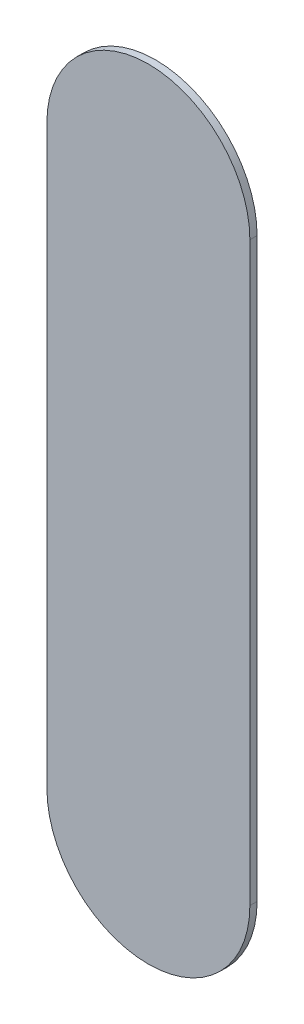
ISO-10303-21;
HEADER;
FILE_DESCRIPTION(('STEP AP214'),'2;1');
FILE_NAME('part.step','',(''),(''),'','','');
FILE_SCHEMA(('AUTOMOTIVE_DESIGN { 1 0 10303 214 1 1 1 1 }'));
ENDSEC;
DATA;
#1=APPLICATION_CONTEXT('core data for automotive mechanical design processes');
#2=APPLICATION_PROTOCOL_DEFINITION('international standard','automotive_design',2000,#1);
#3=PRODUCT_CONTEXT('',#1,'mechanical');
#4=PRODUCT('Part','Part','',(#3));
#5=PRODUCT_RELATED_PRODUCT_CATEGORY('part','',(#4));
#6=PRODUCT_DEFINITION_FORMATION('','',#4);
#7=PRODUCT_DEFINITION_CONTEXT('part definition',#1,'design');
#8=PRODUCT_DEFINITION('design','',#6,#7);
#9=PRODUCT_DEFINITION_SHAPE('','',#8);
#10=(LENGTH_UNIT() NAMED_UNIT(*) SI_UNIT(.MILLI.,.METRE.));
#11=(NAMED_UNIT(*) PLANE_ANGLE_UNIT() SI_UNIT($,.RADIAN.));
#12=(NAMED_UNIT(*) SI_UNIT($,.STERADIAN.) SOLID_ANGLE_UNIT());
#13=UNCERTAINTY_MEASURE_WITH_UNIT(LENGTH_MEASURE(1.E-05),#10,'distance_accuracy_value','');
#14=(GEOMETRIC_REPRESENTATION_CONTEXT(3) GLOBAL_UNCERTAINTY_ASSIGNED_CONTEXT((#13)) GLOBAL_UNIT_ASSIGNED_CONTEXT((#10,
#11,#12)) REPRESENTATION_CONTEXT('',''));
#15=CARTESIAN_POINT('',(0.,0.,0.));
#16=DIRECTION('',(0.,0.,1.));
#17=DIRECTION('',(1.,0.,0.));
#18=AXIS2_PLACEMENT_3D('',#15,#16,#17);
#19=CARTESIAN_POINT('',(35.5091746,115.2684004,0.));
#20=DIRECTION('',(-1.,0.,0.));
#21=DIRECTION('',(0.,1.,0.));
#22=AXIS2_PLACEMENT_3D('',#19,#20,#21);
#23=PLANE('',#22);
#24=DIRECTION('',(0.,1.,0.));
#25=VECTOR('',#24,1.);
#26=CARTESIAN_POINT('',(35.5091746,115.2684004,0.03556));
#27=LINE('',#26,#25);
#28=CARTESIAN_POINT('',(35.5091746,115.2684004,0.03556));
#29=VERTEX_POINT('',#28);
#30=CARTESIAN_POINT('',(35.5091746,118.1091872,0.03556));
#31=VERTEX_POINT('',#30);
#32=EDGE_CURVE('E11',#29,#31,#27,.T.);
#33=ORIENTED_EDGE('',*,*,#32,.F.);
#34=DIRECTION('',(0.,0.,1.));
#35=VECTOR('',#34,1.);
#36=CARTESIAN_POINT('',(35.5091746,115.2684004,0.));
#37=LINE('',#36,#35);
#38=CARTESIAN_POINT('',(35.5091746,115.2684004,0.));
#39=VERTEX_POINT('',#38);
#40=EDGE_CURVE('E24',#39,#29,#37,.T.);
#41=ORIENTED_EDGE('',*,*,#40,.F.);
#42=DIRECTION('',(0.,1.,0.));
#43=VECTOR('',#42,1.);
#44=CARTESIAN_POINT('',(35.5091746,115.2684004,0.));
#45=LINE('',#44,#43);
#46=CARTESIAN_POINT('',(35.5091746,118.1091872,0.));
#47=VERTEX_POINT('',#46);
#48=EDGE_CURVE('E75',#39,#47,#45,.T.);
#49=ORIENTED_EDGE('',*,*,#48,.T.);
#50=DIRECTION('',(0.,0.,1.));
#51=VECTOR('',#50,1.);
#52=CARTESIAN_POINT('',(35.5091746,118.1091872,0.));
#53=LINE('',#52,#51);
#54=EDGE_CURVE('E37',#47,#31,#53,.T.);
#55=ORIENTED_EDGE('',*,*,#54,.T.);
#56=EDGE_LOOP('',(#33,#41,#49,#55));
#57=FACE_BOUND('',#56,.T.);
#58=ADVANCED_FACE('F17',(#57),#23,.F.);
#59=CARTESIAN_POINT('',(35.0091756,118.1091872,0.));
#60=DIRECTION('',(0.,0.,-1.));
#61=DIRECTION('',(1.,0.,0.));
#62=AXIS2_PLACEMENT_3D('',#59,#60,#61);
#63=CYLINDRICAL_SURFACE('',#62,0.499999);
#64=CARTESIAN_POINT('',(35.0091756,118.1091872,0.03556));
#65=DIRECTION('',(0.,0.,1.));
#66=DIRECTION('',(1.,0.,0.));
#67=AXIS2_PLACEMENT_3D('',#64,#65,#66);
#68=CIRCLE('',#67,0.499999);
#69=CARTESIAN_POINT('',(34.5091766,118.1091872,0.03556));
#70=VERTEX_POINT('',#69);
#71=EDGE_CURVE('E83',#31,#70,#68,.T.);
#72=ORIENTED_EDGE('',*,*,#71,.F.);
#73=ORIENTED_EDGE('',*,*,#54,.F.);
#74=CARTESIAN_POINT('',(35.0091756,118.1091872,0.));
#75=DIRECTION('',(0.,0.,1.));
#76=DIRECTION('',(1.,0.,0.));
#77=AXIS2_PLACEMENT_3D('',#74,#75,#76);
#78=CIRCLE('',#77,0.499999);
#79=CARTESIAN_POINT('',(34.5091766,118.1091872,0.));
#80=VERTEX_POINT('',#79);
#81=EDGE_CURVE('E81',#47,#80,#78,.T.);
#82=ORIENTED_EDGE('',*,*,#81,.T.);
#83=DIRECTION('',(0.,0.,1.));
#84=VECTOR('',#83,1.);
#85=CARTESIAN_POINT('',(34.5091766,118.1091872,0.));
#86=LINE('',#85,#84);
#87=EDGE_CURVE('E67',#80,#70,#86,.T.);
#88=ORIENTED_EDGE('',*,*,#87,.T.);
#89=EDGE_LOOP('',(#72,#73,#82,#88));
#90=FACE_BOUND('',#89,.T.);
#91=ADVANCED_FACE('F89',(#90),#63,.T.);
#92=CARTESIAN_POINT('',(34.5091766,118.1091872,0.));
#93=DIRECTION('',(1.,0.,0.));
#94=DIRECTION('',(0.,-1.,0.));
#95=AXIS2_PLACEMENT_3D('',#92,#93,#94);
#96=PLANE('',#95);
#97=DIRECTION('',(0.,-1.,0.));
#98=VECTOR('',#97,1.);
#99=CARTESIAN_POINT('',(34.5091766,118.1091872,0.03556));
#100=LINE('',#99,#98);
#101=CARTESIAN_POINT('',(34.5091766,115.2684004,0.03556));
#102=VERTEX_POINT('',#101);
#103=EDGE_CURVE('E71',#70,#102,#100,.T.);
#104=ORIENTED_EDGE('',*,*,#103,.F.);
#105=ORIENTED_EDGE('',*,*,#87,.F.);
#106=DIRECTION('',(0.,-1.,0.));
#107=VECTOR('',#106,1.);
#108=CARTESIAN_POINT('',(34.5091766,118.1091872,0.));
#109=LINE('',#108,#107);
#110=CARTESIAN_POINT('',(34.5091766,115.2684004,0.));
#111=VERTEX_POINT('',#110);
#112=EDGE_CURVE('E63',#80,#111,#109,.T.);
#113=ORIENTED_EDGE('',*,*,#112,.T.);
#114=DIRECTION('',(0.,0.,1.));
#115=VECTOR('',#114,1.);
#116=CARTESIAN_POINT('',(34.5091766,115.2684004,0.));
#117=LINE('',#116,#115);
#118=EDGE_CURVE('E53',#111,#102,#117,.T.);
#119=ORIENTED_EDGE('',*,*,#118,.T.);
#120=EDGE_LOOP('',(#104,#105,#113,#119));
#121=FACE_BOUND('',#120,.T.);
#122=ADVANCED_FACE('F66',(#121),#96,.F.);
#123=CARTESIAN_POINT('',(35.0091756,115.2684004,0.));
#124=DIRECTION('',(0.,0.,-1.));
#125=DIRECTION('',(-1.,0.,0.));
#126=AXIS2_PLACEMENT_3D('',#123,#124,#125);
#127=CYLINDRICAL_SURFACE('',#126,0.499998999999995);
#128=CARTESIAN_POINT('',(35.0091756,115.2684004,0.03556));
#129=DIRECTION('',(0.,0.,1.));
#130=DIRECTION('',(-1.,0.,0.));
#131=AXIS2_PLACEMENT_3D('',#128,#129,#130);
#132=CIRCLE('',#131,0.499998999999995);
#133=EDGE_CURVE('E59',#102,#29,#132,.T.);
#134=ORIENTED_EDGE('',*,*,#133,.F.);
#135=ORIENTED_EDGE('',*,*,#118,.F.);
#136=CARTESIAN_POINT('',(35.0091756,115.2684004,0.));
#137=DIRECTION('',(0.,0.,1.));
#138=DIRECTION('',(-1.,0.,0.));
#139=AXIS2_PLACEMENT_3D('',#136,#137,#138);
#140=CIRCLE('',#139,0.499998999999995);
#141=EDGE_CURVE('E57',#111,#39,#140,.T.);
#142=ORIENTED_EDGE('',*,*,#141,.T.);
#143=ORIENTED_EDGE('',*,*,#40,.T.);
#144=EDGE_LOOP('',(#134,#135,#142,#143));
#145=FACE_BOUND('',#144,.T.);
#146=ADVANCED_FACE('F55',(#145),#127,.T.);
#147=CARTESIAN_POINT('',(35.5091746,115.2684004,0.));
#148=DIRECTION('',(0.,0.,-1.));
#149=DIRECTION('',(-1.,0.,0.));
#150=AXIS2_PLACEMENT_3D('',#147,#148,#149);
#151=PLANE('',#150);
#152=ORIENTED_EDGE('',*,*,#141,.F.);
#153=ORIENTED_EDGE('',*,*,#112,.F.);
#154=ORIENTED_EDGE('',*,*,#81,.F.);
#155=ORIENTED_EDGE('',*,*,#48,.F.);
#156=EDGE_LOOP('',(#152,#153,#154,#155));
#157=FACE_BOUND('',#156,.T.);
#158=ADVANCED_FACE('F74',(#157),#151,.T.);
#159=CARTESIAN_POINT('',(35.5091746,115.2684004,0.03556));
#160=DIRECTION('',(0.,0.,-1.));
#161=DIRECTION('',(-1.,0.,0.));
#162=AXIS2_PLACEMENT_3D('',#159,#160,#161);
#163=PLANE('',#162);
#164=ORIENTED_EDGE('',*,*,#32,.T.);
#165=ORIENTED_EDGE('',*,*,#71,.T.);
#166=ORIENTED_EDGE('',*,*,#103,.T.);
#167=ORIENTED_EDGE('',*,*,#133,.T.);
#168=EDGE_LOOP('',(#164,#165,#166,#167));
#169=FACE_BOUND('',#168,.T.);
#170=ADVANCED_FACE('F91',(#169),#163,.F.);
#171=CLOSED_SHELL('',(#58,#91,#122,#146,#158,#170));
#172=MANIFOLD_SOLID_BREP('B1',#171);
#173=ADVANCED_BREP_SHAPE_REPRESENTATION('',(#18,#172),#14);
#174=SHAPE_DEFINITION_REPRESENTATION(#9,#173);
ENDSEC;
END-ISO-10303-21;
